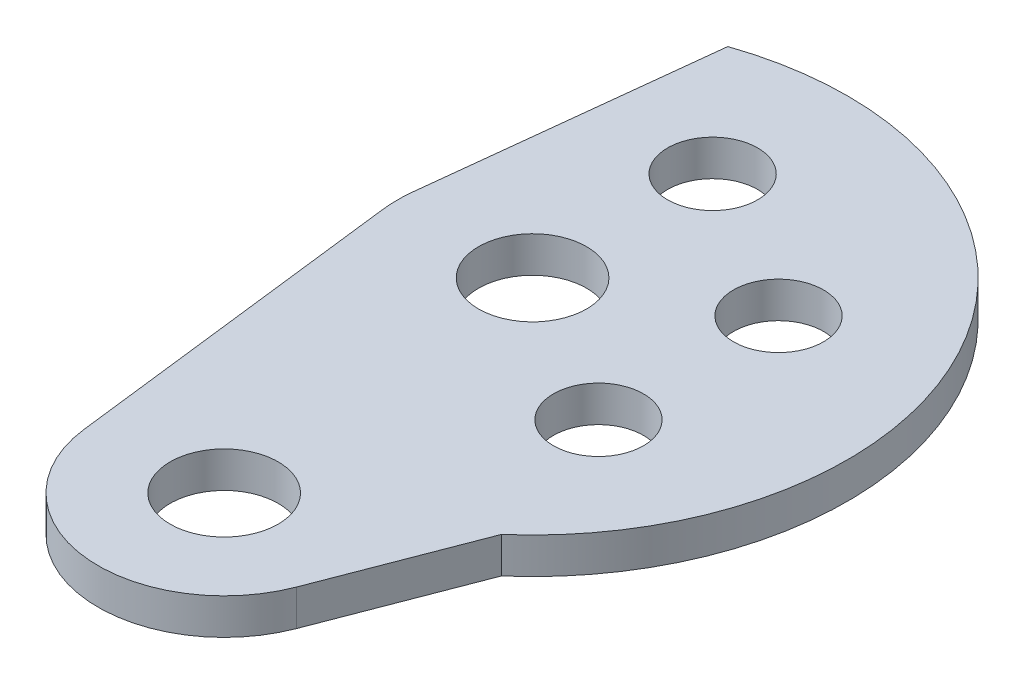
ISO-10303-21;
HEADER;
FILE_DESCRIPTION(('STEP AP214'),'2;1');
FILE_NAME('part.step','',(''),(''),'','','');
FILE_SCHEMA(('AUTOMOTIVE_DESIGN { 1 0 10303 214 1 1 1 1 }'));
ENDSEC;
DATA;
#1=APPLICATION_CONTEXT('core data for automotive mechanical design processes');
#2=APPLICATION_PROTOCOL_DEFINITION('international standard','automotive_design',2000,#1);
#3=PRODUCT_CONTEXT('',#1,'mechanical');
#4=PRODUCT('Part','Part','',(#3));
#5=PRODUCT_RELATED_PRODUCT_CATEGORY('part','',(#4));
#6=PRODUCT_DEFINITION_FORMATION('','',#4);
#7=PRODUCT_DEFINITION_CONTEXT('part definition',#1,'design');
#8=PRODUCT_DEFINITION('design','',#6,#7);
#9=PRODUCT_DEFINITION_SHAPE('','',#8);
#10=(LENGTH_UNIT() NAMED_UNIT(*) SI_UNIT(.MILLI.,.METRE.));
#11=(NAMED_UNIT(*) PLANE_ANGLE_UNIT() SI_UNIT($,.RADIAN.));
#12=(NAMED_UNIT(*) SI_UNIT($,.STERADIAN.) SOLID_ANGLE_UNIT());
#13=UNCERTAINTY_MEASURE_WITH_UNIT(LENGTH_MEASURE(1.E-05),#10,'distance_accuracy_value','');
#14=(GEOMETRIC_REPRESENTATION_CONTEXT(3) GLOBAL_UNCERTAINTY_ASSIGNED_CONTEXT((#13)) GLOBAL_UNIT_ASSIGNED_CONTEXT((#10,
#11,#12)) REPRESENTATION_CONTEXT('',''));
#15=CARTESIAN_POINT('',(0.,0.,0.));
#16=DIRECTION('',(0.,0.,1.));
#17=DIRECTION('',(1.,0.,0.));
#18=AXIS2_PLACEMENT_3D('',#15,#16,#17);
#19=CARTESIAN_POINT('',(0.,2.,0.));
#20=DIRECTION('',(0.,-1.,0.));
#21=DIRECTION('',(0.,0.,-1.));
#22=AXIS2_PLACEMENT_3D('',#19,#20,#21);
#23=CYLINDRICAL_SURFACE('',#22,7.5);
#24=DIRECTION('',(0.,1.,0.));
#25=VECTOR('',#24,1.);
#26=CARTESIAN_POINT('',(-7.4457052990066,0.,0.900817739803716));
#27=LINE('',#26,#25);
#28=CARTESIAN_POINT('',(-7.4457052990066,0.,0.900817739803717));
#29=VERTEX_POINT('',#28);
#30=CARTESIAN_POINT('',(-7.4457052990066,2.,0.900817739803717));
#31=VERTEX_POINT('',#30);
#32=EDGE_CURVE('E63',#29,#31,#27,.T.);
#33=ORIENTED_EDGE('',*,*,#32,.T.);
#34=CARTESIAN_POINT('',(0.,2.,0.));
#35=DIRECTION('',(0.,1.,0.));
#36=DIRECTION('',(0.,0.,1.));
#37=AXIS2_PLACEMENT_3D('',#34,#35,#36);
#38=CIRCLE('',#37,7.5);
#39=CARTESIAN_POINT('',(-7.45384122730723,2.,-0.830813431580786));
#40=VERTEX_POINT('',#39);
#41=EDGE_CURVE('E169',#40,#31,#38,.T.);
#42=ORIENTED_EDGE('',*,*,#41,.F.);
#43=DIRECTION('',(0.,-1.,0.));
#44=VECTOR('',#43,1.);
#45=CARTESIAN_POINT('',(-7.45384122730723,2.,-0.830813431580786));
#46=LINE('',#45,#44);
#47=CARTESIAN_POINT('',(-7.45384122730723,0.,-0.830813431580786));
#48=VERTEX_POINT('',#47);
#49=EDGE_CURVE('E178',#40,#48,#46,.T.);
#50=ORIENTED_EDGE('',*,*,#49,.T.);
#51=CARTESIAN_POINT('',(0.,0.,0.));
#52=DIRECTION('',(0.,1.,0.));
#53=DIRECTION('',(0.,0.,1.));
#54=AXIS2_PLACEMENT_3D('',#51,#52,#53);
#55=CIRCLE('',#54,7.5);
#56=EDGE_CURVE('E68',#48,#29,#55,.T.);
#57=ORIENTED_EDGE('',*,*,#56,.T.);
#58=EDGE_LOOP('',(#33,#42,#50,#57));
#59=FACE_BOUND('',#58,.T.);
#60=ADVANCED_FACE('F47',(#59),#23,.T.);
#61=CARTESIAN_POINT('',(0.,2.,0.));
#62=DIRECTION('',(0.,-1.,0.));
#63=DIRECTION('',(0.,0.,-1.));
#64=AXIS2_PLACEMENT_3D('',#61,#62,#63);
#65=CYLINDRICAL_SURFACE('',#64,17.5);
#66=CARTESIAN_POINT('',(0.,0.,0.));
#67=DIRECTION('',(0.,1.,0.));
#68=DIRECTION('',(0.,0.,1.));
#69=AXIS2_PLACEMENT_3D('',#66,#67,#68);
#70=CIRCLE('',#69,17.5);
#71=CARTESIAN_POINT('',(11.47712910958,0.,13.210810247749));
#72=VERTEX_POINT('',#71);
#73=CARTESIAN_POINT('',(-5.70233272433673,0.,-16.5448904952846));
#74=VERTEX_POINT('',#73);
#75=EDGE_CURVE('E192',#72,#74,#70,.T.);
#76=ORIENTED_EDGE('',*,*,#75,.T.);
#77=DIRECTION('',(0.,-1.,0.));
#78=VECTOR('',#77,1.);
#79=CARTESIAN_POINT('',(-5.70233272433673,2.,-16.5448904952846));
#80=LINE('',#79,#78);
#81=CARTESIAN_POINT('',(-5.70233272433673,2.,-16.5448904952846));
#82=VERTEX_POINT('',#81);
#83=EDGE_CURVE('E56',#82,#74,#80,.T.);
#84=ORIENTED_EDGE('',*,*,#83,.F.);
#85=CARTESIAN_POINT('',(0.,2.,0.));
#86=DIRECTION('',(0.,1.,0.));
#87=DIRECTION('',(0.,0.,1.));
#88=AXIS2_PLACEMENT_3D('',#85,#86,#87);
#89=CIRCLE('',#88,17.5);
#90=CARTESIAN_POINT('',(11.47712910958,2.,13.210810247749));
#91=VERTEX_POINT('',#90);
#92=EDGE_CURVE('E172',#91,#82,#89,.T.);
#93=ORIENTED_EDGE('',*,*,#92,.F.);
#94=DIRECTION('',(0.,-1.,0.));
#95=VECTOR('',#94,1.);
#96=CARTESIAN_POINT('',(11.47712910958,2.,13.210810247749));
#97=LINE('',#96,#95);
#98=EDGE_CURVE('E11',#91,#72,#97,.T.);
#99=ORIENTED_EDGE('',*,*,#98,.T.);
#100=EDGE_LOOP('',(#76,#84,#93,#99));
#101=FACE_BOUND('',#100,.T.);
#102=ADVANCED_FACE('F208',(#101),#65,.T.);
#103=CARTESIAN_POINT('',(0.,2.,-10.));
#104=DIRECTION('',(0.,-1.,0.));
#105=DIRECTION('',(0.,0.,-1.));
#106=AXIS2_PLACEMENT_3D('',#103,#104,#105);
#107=CYLINDRICAL_SURFACE('',#106,2.5);
#108=CARTESIAN_POINT('',(0.,2.,-10.));
#109=DIRECTION('',(0.,1.,0.));
#110=DIRECTION('',(0.,0.,1.));
#111=AXIS2_PLACEMENT_3D('',#108,#109,#110);
#112=CIRCLE('',#111,2.5);
#113=CARTESIAN_POINT('',(0.,2.,-7.5));
#114=VERTEX_POINT('',#113);
#115=EDGE_CURVE('E165',#114,#114,#112,.T.);
#116=ORIENTED_EDGE('',*,*,#115,.T.);
#117=EDGE_LOOP('',(#116));
#118=FACE_BOUND('',#117,.T.);
#119=CARTESIAN_POINT('',(0.,0.,-10.));
#120=DIRECTION('',(0.,1.,0.));
#121=DIRECTION('',(0.,0.,1.));
#122=AXIS2_PLACEMENT_3D('',#119,#120,#121);
#123=CIRCLE('',#122,2.5);
#124=CARTESIAN_POINT('',(0.,0.,-7.5));
#125=VERTEX_POINT('',#124);
#126=EDGE_CURVE('E186',#125,#125,#123,.T.);
#127=ORIENTED_EDGE('',*,*,#126,.F.);
#128=EDGE_LOOP('',(#127));
#129=FACE_BOUND('',#128,.T.);
#130=ADVANCED_FACE('F221',(#118,#129),#107,.F.);
#131=CARTESIAN_POINT('',(8.66025403784436,2.,-5.00000000000004));
#132=DIRECTION('',(0.,-1.,0.));
#133=DIRECTION('',(0.,0.,-1.));
#134=AXIS2_PLACEMENT_3D('',#131,#132,#133);
#135=CYLINDRICAL_SURFACE('',#134,2.5);
#136=CARTESIAN_POINT('',(8.66025403784436,2.,-5.00000000000004));
#137=DIRECTION('',(0.,1.,0.));
#138=DIRECTION('',(0.,0.,1.));
#139=AXIS2_PLACEMENT_3D('',#136,#137,#138);
#140=CIRCLE('',#139,2.5);
#141=CARTESIAN_POINT('',(8.66025403784436,2.,-2.50000000000005));
#142=VERTEX_POINT('',#141);
#143=EDGE_CURVE('E160',#142,#142,#140,.T.);
#144=ORIENTED_EDGE('',*,*,#143,.T.);
#145=EDGE_LOOP('',(#144));
#146=FACE_BOUND('',#145,.T.);
#147=CARTESIAN_POINT('',(8.66025403784436,0.,-5.00000000000004));
#148=DIRECTION('',(0.,1.,0.));
#149=DIRECTION('',(0.,0.,1.));
#150=AXIS2_PLACEMENT_3D('',#147,#148,#149);
#151=CIRCLE('',#150,2.5);
#152=CARTESIAN_POINT('',(8.66025403784436,0.,-2.50000000000005));
#153=VERTEX_POINT('',#152);
#154=EDGE_CURVE('E182',#153,#153,#151,.T.);
#155=ORIENTED_EDGE('',*,*,#154,.F.);
#156=EDGE_LOOP('',(#155));
#157=FACE_BOUND('',#156,.T.);
#158=ADVANCED_FACE('F226',(#146,#157),#135,.F.);
#159=CARTESIAN_POINT('',(8.6602540378444,2.,4.99999999999998));
#160=DIRECTION('',(0.,-1.,0.));
#161=DIRECTION('',(0.,0.,-1.));
#162=AXIS2_PLACEMENT_3D('',#159,#160,#161);
#163=CYLINDRICAL_SURFACE('',#162,2.5);
#164=CARTESIAN_POINT('',(8.6602540378444,2.,4.99999999999998));
#165=DIRECTION('',(0.,1.,0.));
#166=DIRECTION('',(0.,0.,1.));
#167=AXIS2_PLACEMENT_3D('',#164,#165,#166);
#168=CIRCLE('',#167,2.5);
#169=CARTESIAN_POINT('',(8.6602540378444,2.,7.49999999999998));
#170=VERTEX_POINT('',#169);
#171=EDGE_CURVE('E156',#170,#170,#168,.T.);
#172=ORIENTED_EDGE('',*,*,#171,.T.);
#173=EDGE_LOOP('',(#172));
#174=FACE_BOUND('',#173,.T.);
#175=CARTESIAN_POINT('',(8.6602540378444,0.,4.99999999999998));
#176=DIRECTION('',(0.,1.,0.));
#177=DIRECTION('',(0.,0.,1.));
#178=AXIS2_PLACEMENT_3D('',#175,#176,#177);
#179=CIRCLE('',#178,2.5);
#180=CARTESIAN_POINT('',(8.6602540378444,0.,7.49999999999998));
#181=VERTEX_POINT('',#180);
#182=EDGE_CURVE('E153',#181,#181,#179,.T.);
#183=ORIENTED_EDGE('',*,*,#182,.F.);
#184=EDGE_LOOP('',(#183));
#185=FACE_BOUND('',#184,.T.);
#186=ADVANCED_FACE('F49',(#174,#185),#163,.F.);
#187=CARTESIAN_POINT('',(-7.45384122730723,2.,-0.830813431580787));
#188=DIRECTION('',(0.993845496974297,0.,0.110775124210772));
#189=DIRECTION('',(0.110775124210772,0.,-0.993845496974297));
#190=AXIS2_PLACEMENT_3D('',#187,#188,#189);
#191=PLANE('',#190);
#192=DIRECTION('',(-0.110775124210772,0.,0.993845496974297));
#193=VECTOR('',#192,1.);
#194=CARTESIAN_POINT('',(-7.45384122730723,0.,-0.830813431580787));
#195=LINE('',#194,#193);
#196=EDGE_CURVE('E161',#74,#48,#195,.T.);
#197=ORIENTED_EDGE('',*,*,#196,.T.);
#198=ORIENTED_EDGE('',*,*,#49,.F.);
#199=DIRECTION('',(-0.110775124210772,0.,0.993845496974297));
#200=VECTOR('',#199,1.);
#201=CARTESIAN_POINT('',(-7.45384122730723,2.,-0.830813431580787));
#202=LINE('',#201,#200);
#203=EDGE_CURVE('E175',#82,#40,#202,.T.);
#204=ORIENTED_EDGE('',*,*,#203,.F.);
#205=ORIENTED_EDGE('',*,*,#83,.T.);
#206=EDGE_LOOP('',(#197,#198,#204,#205));
#207=FACE_BOUND('',#206,.T.);
#208=ADVANCED_FACE('F204',(#207),#191,.F.);
#209=CARTESIAN_POINT('',(0.,2.,0.));
#210=DIRECTION('',(0.,1.,0.));
#211=DIRECTION('',(0.,0.,1.));
#212=AXIS2_PLACEMENT_3D('',#209,#210,#211);
#213=PLANE('',#212);
#214=CARTESIAN_POINT('',(0.,2.,0.));
#215=DIRECTION('',(0.,1.,0.));
#216=DIRECTION('',(0.,0.,1.));
#217=AXIS2_PLACEMENT_3D('',#214,#215,#216);
#218=CIRCLE('',#217,3.);
#219=CARTESIAN_POINT('',(0.,2.,3.));
#220=VERTEX_POINT('',#219);
#221=EDGE_CURVE('E134',#220,#220,#218,.T.);
#222=ORIENTED_EDGE('',*,*,#221,.F.);
#223=EDGE_LOOP('',(#222));
#224=FACE_BOUND('',#223,.T.);
#225=ORIENTED_EDGE('',*,*,#171,.F.);
#226=EDGE_LOOP('',(#225));
#227=FACE_BOUND('',#226,.T.);
#228=ORIENTED_EDGE('',*,*,#143,.F.);
#229=EDGE_LOOP('',(#228));
#230=FACE_BOUND('',#229,.T.);
#231=ORIENTED_EDGE('',*,*,#115,.F.);
#232=EDGE_LOOP('',(#231));
#233=FACE_BOUND('',#232,.T.);
#234=ORIENTED_EDGE('',*,*,#41,.T.);
#235=DIRECTION('',(0.120109031973829,0.,0.992760706534213));
#236=VECTOR('',#235,1.);
#237=CARTESIAN_POINT('',(-7.44570529900659,2.,0.900817739803716));
#238=LINE('',#237,#236);
#239=CARTESIAN_POINT('',(-5.16442401935698,2.,19.7567387123556));
#240=VERTEX_POINT('',#239);
#241=EDGE_CURVE('E142',#31,#240,#238,.T.);
#242=ORIENTED_EDGE('',*,*,#241,.T.);
#243=CARTESIAN_POINT('',(1.7849009263825,2.,18.9159754885388));
#244=DIRECTION('',(0.,1.,0.));
#245=DIRECTION('',(0.,0.,1.));
#246=AXIS2_PLACEMENT_3D('',#243,#244,#245);
#247=CIRCLE('',#246,7.);
#248=CARTESIAN_POINT('',(8.31884420117119,2.,21.4274661379029));
#249=VERTEX_POINT('',#248);
#250=EDGE_CURVE('E106',#240,#249,#247,.T.);
#251=ORIENTED_EDGE('',*,*,#250,.T.);
#252=DIRECTION('',(-0.358784378480595,0.,0.933420467826956));
#253=VECTOR('',#252,1.);
#254=CARTESIAN_POINT('',(14.4239780692304,2.,5.54423026402497));
#255=LINE('',#254,#253);
#256=EDGE_CURVE('E131',#91,#249,#255,.T.);
#257=ORIENTED_EDGE('',*,*,#256,.F.);
#258=ORIENTED_EDGE('',*,*,#92,.T.);
#259=ORIENTED_EDGE('',*,*,#203,.T.);
#260=EDGE_LOOP('',(#234,#242,#251,#257,#258,#259));
#261=FACE_BOUND('',#260,.T.);
#262=CARTESIAN_POINT('',(1.7849009263825,2.,18.9159754885388));
#263=DIRECTION('',(0.,1.,0.));
#264=DIRECTION('',(0.,0.,1.));
#265=AXIS2_PLACEMENT_3D('',#262,#263,#264);
#266=CIRCLE('',#265,3.);
#267=CARTESIAN_POINT('',(1.7849009263825,2.,21.9159754885388));
#268=VERTEX_POINT('',#267);
#269=EDGE_CURVE('E127',#268,#268,#266,.T.);
#270=ORIENTED_EDGE('',*,*,#269,.F.);
#271=EDGE_LOOP('',(#270));
#272=FACE_BOUND('',#271,.T.);
#273=ADVANCED_FACE('F213',(#224,#227,#230,#233,#261,#272),#213,.T.);
#274=CARTESIAN_POINT('',(0.,0.,0.));
#275=DIRECTION('',(0.,1.,0.));
#276=DIRECTION('',(0.,0.,1.));
#277=AXIS2_PLACEMENT_3D('',#274,#275,#276);
#278=PLANE('',#277);
#279=CARTESIAN_POINT('',(0.,0.,0.));
#280=DIRECTION('',(0.,1.,0.));
#281=DIRECTION('',(0.,0.,1.));
#282=AXIS2_PLACEMENT_3D('',#279,#280,#281);
#283=CIRCLE('',#282,3.);
#284=CARTESIAN_POINT('',(0.,0.,3.));
#285=VERTEX_POINT('',#284);
#286=EDGE_CURVE('E145',#285,#285,#283,.T.);
#287=ORIENTED_EDGE('',*,*,#286,.T.);
#288=EDGE_LOOP('',(#287));
#289=FACE_BOUND('',#288,.T.);
#290=ORIENTED_EDGE('',*,*,#182,.T.);
#291=EDGE_LOOP('',(#290));
#292=FACE_BOUND('',#291,.T.);
#293=ORIENTED_EDGE('',*,*,#154,.T.);
#294=EDGE_LOOP('',(#293));
#295=FACE_BOUND('',#294,.T.);
#296=ORIENTED_EDGE('',*,*,#126,.T.);
#297=EDGE_LOOP('',(#296));
#298=FACE_BOUND('',#297,.T.);
#299=ORIENTED_EDGE('',*,*,#56,.F.);
#300=ORIENTED_EDGE('',*,*,#196,.F.);
#301=ORIENTED_EDGE('',*,*,#75,.F.);
#302=DIRECTION('',(-0.358784378480595,0.,0.933420467826956));
#303=VECTOR('',#302,1.);
#304=CARTESIAN_POINT('',(14.4239780692304,0.,5.54423026402497));
#305=LINE('',#304,#303);
#306=CARTESIAN_POINT('',(8.31884420117119,0.,21.4274661379029));
#307=VERTEX_POINT('',#306);
#308=EDGE_CURVE('E121',#72,#307,#305,.T.);
#309=ORIENTED_EDGE('',*,*,#308,.T.);
#310=CARTESIAN_POINT('',(1.7849009263825,0.,18.9159754885388));
#311=DIRECTION('',(0.,1.,0.));
#312=DIRECTION('',(0.,0.,1.));
#313=AXIS2_PLACEMENT_3D('',#310,#311,#312);
#314=CIRCLE('',#313,7.);
#315=CARTESIAN_POINT('',(-5.16442401935698,0.,19.7567387123556));
#316=VERTEX_POINT('',#315);
#317=EDGE_CURVE('E104',#316,#307,#314,.T.);
#318=ORIENTED_EDGE('',*,*,#317,.F.);
#319=DIRECTION('',(0.120109031973829,0.,0.992760706534213));
#320=VECTOR('',#319,1.);
#321=CARTESIAN_POINT('',(-7.44570529900659,0.,0.900817739803716));
#322=LINE('',#321,#320);
#323=EDGE_CURVE('E119',#29,#316,#322,.T.);
#324=ORIENTED_EDGE('',*,*,#323,.F.);
#325=EDGE_LOOP('',(#299,#300,#301,#309,#318,#324));
#326=FACE_BOUND('',#325,.T.);
#327=CARTESIAN_POINT('',(1.7849009263825,0.,18.9159754885388));
#328=DIRECTION('',(0.,1.,0.));
#329=DIRECTION('',(0.,0.,1.));
#330=AXIS2_PLACEMENT_3D('',#327,#328,#329);
#331=CIRCLE('',#330,3.);
#332=CARTESIAN_POINT('',(1.7849009263825,0.,21.9159754885388));
#333=VERTEX_POINT('',#332);
#334=EDGE_CURVE('E113',#333,#333,#331,.T.);
#335=ORIENTED_EDGE('',*,*,#334,.T.);
#336=EDGE_LOOP('',(#335));
#337=FACE_BOUND('',#336,.T.);
#338=ADVANCED_FACE('F117',(#289,#292,#295,#298,#326,#337),#278,.F.);
#339=CARTESIAN_POINT('',(-7.44570529900659,0.,0.900817739803716));
#340=DIRECTION('',(-0.992760706534213,0.,0.120109031973829));
#341=DIRECTION('',(0.120109031973829,0.,0.992760706534213));
#342=AXIS2_PLACEMENT_3D('',#339,#340,#341);
#343=PLANE('',#342);
#344=ORIENTED_EDGE('',*,*,#241,.F.);
#345=ORIENTED_EDGE('',*,*,#32,.F.);
#346=ORIENTED_EDGE('',*,*,#323,.T.);
#347=DIRECTION('',(0.,1.,0.));
#348=VECTOR('',#347,1.);
#349=CARTESIAN_POINT('',(-5.16442401935698,0.,19.7567387123556));
#350=LINE('',#349,#348);
#351=EDGE_CURVE('E101',#316,#240,#350,.T.);
#352=ORIENTED_EDGE('',*,*,#351,.T.);
#353=EDGE_LOOP('',(#344,#345,#346,#352));
#354=FACE_BOUND('',#353,.T.);
#355=ADVANCED_FACE('F125',(#354),#343,.T.);
#356=CARTESIAN_POINT('',(14.4239780692304,0.,5.54423026402497));
#357=DIRECTION('',(-0.933420467826956,0.,-0.358784378480595));
#358=DIRECTION('',(-0.358784378480595,0.,0.933420467826956));
#359=AXIS2_PLACEMENT_3D('',#356,#357,#358);
#360=PLANE('',#359);
#361=ORIENTED_EDGE('',*,*,#256,.T.);
#362=DIRECTION('',(0.,1.,0.));
#363=VECTOR('',#362,1.);
#364=CARTESIAN_POINT('',(8.31884420117119,0.,21.4274661379029));
#365=LINE('',#364,#363);
#366=EDGE_CURVE('E112',#307,#249,#365,.T.);
#367=ORIENTED_EDGE('',*,*,#366,.F.);
#368=ORIENTED_EDGE('',*,*,#308,.F.);
#369=ORIENTED_EDGE('',*,*,#98,.F.);
#370=EDGE_LOOP('',(#361,#367,#368,#369));
#371=FACE_BOUND('',#370,.T.);
#372=ADVANCED_FACE('F211',(#371),#360,.F.);
#373=CARTESIAN_POINT('',(1.7849009263825,0.,18.9159754885388));
#374=DIRECTION('',(0.,1.,0.));
#375=DIRECTION('',(0.,0.,1.));
#376=AXIS2_PLACEMENT_3D('',#373,#374,#375);
#377=CYLINDRICAL_SURFACE('',#376,7.);
#378=ORIENTED_EDGE('',*,*,#250,.F.);
#379=ORIENTED_EDGE('',*,*,#351,.F.);
#380=ORIENTED_EDGE('',*,*,#317,.T.);
#381=ORIENTED_EDGE('',*,*,#366,.T.);
#382=EDGE_LOOP('',(#378,#379,#380,#381));
#383=FACE_BOUND('',#382,.T.);
#384=ADVANCED_FACE('F103',(#383),#377,.T.);
#385=CARTESIAN_POINT('',(1.7849009263825,0.,18.9159754885388));
#386=DIRECTION('',(0.,1.,0.));
#387=DIRECTION('',(0.,0.,1.));
#388=AXIS2_PLACEMENT_3D('',#385,#386,#387);
#389=CYLINDRICAL_SURFACE('',#388,3.);
#390=ORIENTED_EDGE('',*,*,#334,.F.);
#391=EDGE_LOOP('',(#390));
#392=FACE_BOUND('',#391,.T.);
#393=ORIENTED_EDGE('',*,*,#269,.T.);
#394=EDGE_LOOP('',(#393));
#395=FACE_BOUND('',#394,.T.);
#396=ADVANCED_FACE('F298',(#392,#395),#389,.F.);
#397=CARTESIAN_POINT('',(0.,0.,0.));
#398=DIRECTION('',(0.,1.,0.));
#399=DIRECTION('',(0.,0.,1.));
#400=AXIS2_PLACEMENT_3D('',#397,#398,#399);
#401=CYLINDRICAL_SURFACE('',#400,3.);
#402=ORIENTED_EDGE('',*,*,#286,.F.);
#403=EDGE_LOOP('',(#402));
#404=FACE_BOUND('',#403,.T.);
#405=ORIENTED_EDGE('',*,*,#221,.T.);
#406=EDGE_LOOP('',(#405));
#407=FACE_BOUND('',#406,.T.);
#408=ADVANCED_FACE('F305',(#404,#407),#401,.F.);
#409=CLOSED_SHELL('',(#60,#102,#130,#158,#186,#208,#273,#338,#355,#372,#384,#396,#408));
#410=MANIFOLD_SOLID_BREP('B2',#409);
#411=ADVANCED_BREP_SHAPE_REPRESENTATION('',(#18,#410),#14);
#412=SHAPE_DEFINITION_REPRESENTATION(#9,#411);
ENDSEC;
END-ISO-10303-21;
